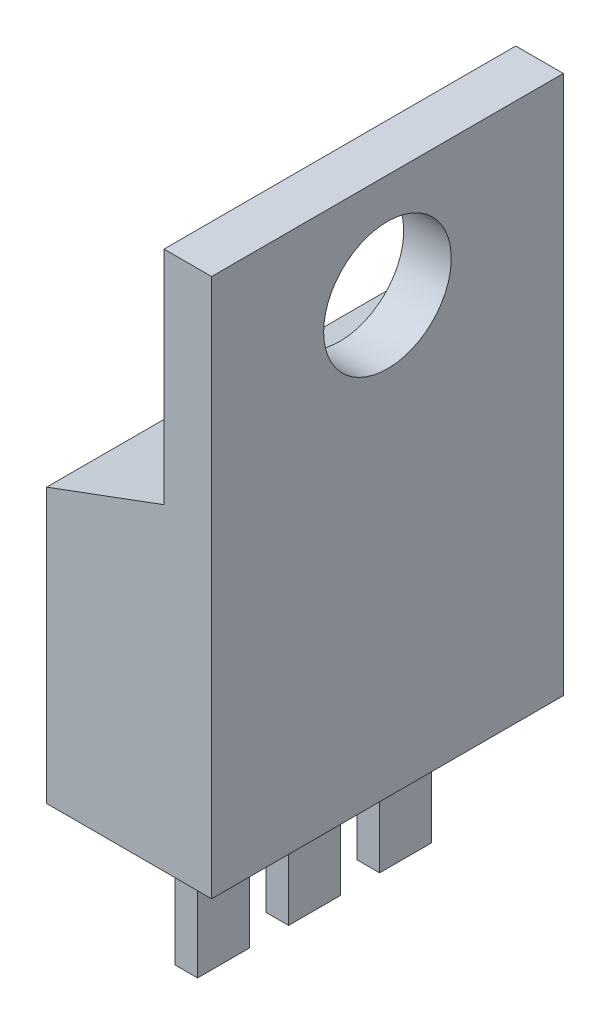
ISO-10303-21;
HEADER;
FILE_DESCRIPTION(('STEP AP214'),'2;1');
FILE_NAME('part.step','',(''),(''),'','','');
FILE_SCHEMA(('AUTOMOTIVE_DESIGN { 1 0 10303 214 1 1 1 1 }'));
ENDSEC;
DATA;
#1=APPLICATION_CONTEXT('core data for automotive mechanical design processes');
#2=APPLICATION_PROTOCOL_DEFINITION('international standard','automotive_design',2000,#1);
#3=PRODUCT_CONTEXT('',#1,'mechanical');
#4=PRODUCT('Part','Part','',(#3));
#5=PRODUCT_RELATED_PRODUCT_CATEGORY('part','',(#4));
#6=PRODUCT_DEFINITION_FORMATION('','',#4);
#7=PRODUCT_DEFINITION_CONTEXT('part definition',#1,'design');
#8=PRODUCT_DEFINITION('design','',#6,#7);
#9=PRODUCT_DEFINITION_SHAPE('','',#8);
#10=(LENGTH_UNIT() NAMED_UNIT(*) SI_UNIT(.MILLI.,.METRE.));
#11=(NAMED_UNIT(*) PLANE_ANGLE_UNIT() SI_UNIT($,.RADIAN.));
#12=(NAMED_UNIT(*) SI_UNIT($,.STERADIAN.) SOLID_ANGLE_UNIT());
#13=UNCERTAINTY_MEASURE_WITH_UNIT(LENGTH_MEASURE(1.E-05),#10,'distance_accuracy_value','');
#14=(GEOMETRIC_REPRESENTATION_CONTEXT(3) GLOBAL_UNCERTAINTY_ASSIGNED_CONTEXT((#13)) GLOBAL_UNIT_ASSIGNED_CONTEXT((#10,
#11,#12)) REPRESENTATION_CONTEXT('',''));
#15=CARTESIAN_POINT('',(0.,0.,0.));
#16=DIRECTION('',(0.,0.,1.));
#17=DIRECTION('',(1.,0.,0.));
#18=AXIS2_PLACEMENT_3D('',#15,#16,#17);
#19=CARTESIAN_POINT('',(-0.74,0.,0.));
#20=DIRECTION('',(1.,0.,0.));
#21=DIRECTION('',(0.,0.,-1.));
#22=AXIS2_PLACEMENT_3D('',#19,#20,#21);
#23=PLANE('',#22);
#24=DIRECTION('',(0.,1.,0.));
#25=VECTOR('',#24,1.);
#26=CARTESIAN_POINT('',(-0.74,-13.21,7.04));
#27=LINE('',#26,#25);
#28=CARTESIAN_POINT('',(-0.74,-9.28,7.04));
#29=VERTEX_POINT('',#28);
#30=CARTESIAN_POINT('',(-0.74,-13.21,7.04));
#31=VERTEX_POINT('',#30);
#32=EDGE_CURVE('E144',#29,#31,#27,.F.);
#33=ORIENTED_EDGE('',*,*,#32,.F.);
#34=DIRECTION('',(0.,0.,-1.));
#35=VECTOR('',#34,1.);
#36=CARTESIAN_POINT('',(-0.74,-9.28,0.));
#37=LINE('',#36,#35);
#38=CARTESIAN_POINT('',(-0.74,-9.28,8.56));
#39=VERTEX_POINT('',#38);
#40=EDGE_CURVE('E141',#29,#39,#37,.F.);
#41=ORIENTED_EDGE('',*,*,#40,.T.);
#42=DIRECTION('',(0.,1.,0.));
#43=VECTOR('',#42,1.);
#44=CARTESIAN_POINT('',(-0.74,-9.28,8.56));
#45=LINE('',#44,#43);
#46=CARTESIAN_POINT('',(-0.74,-13.21,8.56));
#47=VERTEX_POINT('',#46);
#48=EDGE_CURVE('E138',#47,#39,#45,.T.);
#49=ORIENTED_EDGE('',*,*,#48,.F.);
#50=DIRECTION('',(0.,0.,-1.));
#51=VECTOR('',#50,1.);
#52=CARTESIAN_POINT('',(-0.74,-13.21,8.56));
#53=LINE('',#52,#51);
#54=EDGE_CURVE('E157',#31,#47,#53,.F.);
#55=ORIENTED_EDGE('',*,*,#54,.F.);
#56=EDGE_LOOP('',(#33,#41,#49,#55));
#57=FACE_BOUND('',#56,.T.);
#58=ADVANCED_FACE('F17',(#57),#23,.T.);
#59=CARTESIAN_POINT('',(-0.74,0.,0.));
#60=DIRECTION('',(1.,0.,0.));
#61=DIRECTION('',(0.,0.,-1.));
#62=AXIS2_PLACEMENT_3D('',#59,#60,#61);
#63=PLANE('',#62);
#64=DIRECTION('',(0.,1.,0.));
#65=VECTOR('',#64,1.);
#66=CARTESIAN_POINT('',(-0.74,-13.21,4.38));
#67=LINE('',#66,#65);
#68=CARTESIAN_POINT('',(-0.74,-9.28,4.38));
#69=VERTEX_POINT('',#68);
#70=CARTESIAN_POINT('',(-0.74,-13.21,4.38));
#71=VERTEX_POINT('',#70);
#72=EDGE_CURVE('E176',#69,#71,#67,.F.);
#73=ORIENTED_EDGE('',*,*,#72,.F.);
#74=DIRECTION('',(0.,0.,-1.));
#75=VECTOR('',#74,1.);
#76=CARTESIAN_POINT('',(-0.74,-9.28,0.));
#77=LINE('',#76,#75);
#78=CARTESIAN_POINT('',(-0.74,-9.28,5.9));
#79=VERTEX_POINT('',#78);
#80=EDGE_CURVE('E147',#69,#79,#77,.F.);
#81=ORIENTED_EDGE('',*,*,#80,.T.);
#82=DIRECTION('',(0.,1.,0.));
#83=VECTOR('',#82,1.);
#84=CARTESIAN_POINT('',(-0.74,-9.28,5.9));
#85=LINE('',#84,#83);
#86=CARTESIAN_POINT('',(-0.74,-13.21,5.9));
#87=VERTEX_POINT('',#86);
#88=EDGE_CURVE('E173',#87,#79,#85,.T.);
#89=ORIENTED_EDGE('',*,*,#88,.F.);
#90=DIRECTION('',(0.,0.,-1.));
#91=VECTOR('',#90,1.);
#92=CARTESIAN_POINT('',(-0.74,-13.21,5.9));
#93=LINE('',#92,#91);
#94=EDGE_CURVE('E185',#71,#87,#93,.F.);
#95=ORIENTED_EDGE('',*,*,#94,.F.);
#96=EDGE_LOOP('',(#73,#81,#89,#95));
#97=FACE_BOUND('',#96,.T.);
#98=ADVANCED_FACE('F171',(#97),#63,.T.);
#99=CARTESIAN_POINT('',(-0.74,0.,0.));
#100=DIRECTION('',(1.,0.,0.));
#101=DIRECTION('',(0.,0.,-1.));
#102=AXIS2_PLACEMENT_3D('',#99,#100,#101);
#103=PLANE('',#102);
#104=DIRECTION('',(0.,1.,0.));
#105=VECTOR('',#104,1.);
#106=CARTESIAN_POINT('',(-0.74,-13.21,1.72));
#107=LINE('',#106,#105);
#108=CARTESIAN_POINT('',(-0.74,-9.28,1.72));
#109=VERTEX_POINT('',#108);
#110=CARTESIAN_POINT('',(-0.74,-13.21,1.72));
#111=VERTEX_POINT('',#110);
#112=EDGE_CURVE('E250',#109,#111,#107,.F.);
#113=ORIENTED_EDGE('',*,*,#112,.F.);
#114=DIRECTION('',(0.,0.,-1.));
#115=VECTOR('',#114,1.);
#116=CARTESIAN_POINT('',(-0.74,-9.28,0.));
#117=LINE('',#116,#115);
#118=CARTESIAN_POINT('',(-0.74,-9.28,3.24));
#119=VERTEX_POINT('',#118);
#120=EDGE_CURVE('E163',#109,#119,#117,.F.);
#121=ORIENTED_EDGE('',*,*,#120,.T.);
#122=DIRECTION('',(0.,1.,0.));
#123=VECTOR('',#122,1.);
#124=CARTESIAN_POINT('',(-0.74,-9.28,3.24));
#125=LINE('',#124,#123);
#126=CARTESIAN_POINT('',(-0.74,-13.21,3.24));
#127=VERTEX_POINT('',#126);
#128=EDGE_CURVE('E261',#127,#119,#125,.T.);
#129=ORIENTED_EDGE('',*,*,#128,.F.);
#130=DIRECTION('',(0.,0.,-1.));
#131=VECTOR('',#130,1.);
#132=CARTESIAN_POINT('',(-0.74,-13.21,3.24));
#133=LINE('',#132,#131);
#134=EDGE_CURVE('E256',#111,#127,#133,.F.);
#135=ORIENTED_EDGE('',*,*,#134,.F.);
#136=EDGE_LOOP('',(#113,#121,#129,#135));
#137=FACE_BOUND('',#136,.T.);
#138=ADVANCED_FACE('F365',(#137),#103,.T.);
#139=CARTESIAN_POINT('',(-1.4,-9.28,8.56));
#140=DIRECTION('',(0.,0.,1.));
#141=DIRECTION('',(1.,0.,0.));
#142=AXIS2_PLACEMENT_3D('',#139,#140,#141);
#143=PLANE('',#142);
#144=ORIENTED_EDGE('',*,*,#48,.T.);
#145=DIRECTION('',(1.,0.,0.));
#146=VECTOR('',#145,1.);
#147=CARTESIAN_POINT('',(-1.4,-9.28,8.56));
#148=LINE('',#147,#146);
#149=CARTESIAN_POINT('',(-1.4,-9.28,8.56));
#150=VERTEX_POINT('',#149);
#151=EDGE_CURVE('E150',#39,#150,#148,.F.);
#152=ORIENTED_EDGE('',*,*,#151,.T.);
#153=DIRECTION('',(0.,1.,0.));
#154=VECTOR('',#153,1.);
#155=CARTESIAN_POINT('',(-1.4,0.,8.56));
#156=LINE('',#155,#154);
#157=CARTESIAN_POINT('',(-1.4,-13.21,8.56));
#158=VERTEX_POINT('',#157);
#159=EDGE_CURVE('E214',#150,#158,#156,.F.);
#160=ORIENTED_EDGE('',*,*,#159,.T.);
#161=DIRECTION('',(1.,0.,0.));
#162=VECTOR('',#161,1.);
#163=CARTESIAN_POINT('',(-1.4,-13.21,8.56));
#164=LINE('',#163,#162);
#165=EDGE_CURVE('E161',#47,#158,#164,.F.);
#166=ORIENTED_EDGE('',*,*,#165,.F.);
#167=EDGE_LOOP('',(#144,#152,#160,#166));
#168=FACE_BOUND('',#167,.T.);
#169=ADVANCED_FACE('F159',(#168),#143,.T.);
#170=CARTESIAN_POINT('',(-1.4,-13.21,8.56));
#171=DIRECTION('',(0.,-1.,0.));
#172=DIRECTION('',(0.,0.,-1.));
#173=AXIS2_PLACEMENT_3D('',#170,#171,#172);
#174=PLANE('',#173);
#175=ORIENTED_EDGE('',*,*,#165,.T.);
#176=DIRECTION('',(0.,0.,-1.));
#177=VECTOR('',#176,1.);
#178=CARTESIAN_POINT('',(-1.4,-13.21,0.));
#179=LINE('',#178,#177);
#180=CARTESIAN_POINT('',(-1.4,-13.21,7.04));
#181=VERTEX_POINT('',#180);
#182=EDGE_CURVE('E204',#158,#181,#179,.T.);
#183=ORIENTED_EDGE('',*,*,#182,.T.);
#184=DIRECTION('',(-1.,0.,0.));
#185=VECTOR('',#184,1.);
#186=CARTESIAN_POINT('',(-1.4,-13.21,7.04));
#187=LINE('',#186,#185);
#188=EDGE_CURVE('E193',#31,#181,#187,.T.);
#189=ORIENTED_EDGE('',*,*,#188,.F.);
#190=ORIENTED_EDGE('',*,*,#54,.T.);
#191=EDGE_LOOP('',(#175,#183,#189,#190));
#192=FACE_BOUND('',#191,.T.);
#193=ADVANCED_FACE('F202',(#192),#174,.T.);
#194=CARTESIAN_POINT('',(-1.4,-13.21,7.04));
#195=DIRECTION('',(0.,0.,-1.));
#196=DIRECTION('',(-1.,0.,0.));
#197=AXIS2_PLACEMENT_3D('',#194,#195,#196);
#198=PLANE('',#197);
#199=DIRECTION('',(0.,1.,0.));
#200=VECTOR('',#199,1.);
#201=CARTESIAN_POINT('',(-1.4,0.,7.04));
#202=LINE('',#201,#200);
#203=CARTESIAN_POINT('',(-1.4,-9.28,7.04));
#204=VERTEX_POINT('',#203);
#205=EDGE_CURVE('E209',#181,#204,#202,.T.);
#206=ORIENTED_EDGE('',*,*,#205,.T.);
#207=DIRECTION('',(-1.,0.,0.));
#208=VECTOR('',#207,1.);
#209=CARTESIAN_POINT('',(-1.4,-9.28,7.04));
#210=LINE('',#209,#208);
#211=EDGE_CURVE('E191',#204,#29,#210,.F.);
#212=ORIENTED_EDGE('',*,*,#211,.T.);
#213=ORIENTED_EDGE('',*,*,#32,.T.);
#214=ORIENTED_EDGE('',*,*,#188,.T.);
#215=EDGE_LOOP('',(#206,#212,#213,#214));
#216=FACE_BOUND('',#215,.T.);
#217=ADVANCED_FACE('F208',(#216),#198,.T.);
#218=CARTESIAN_POINT('',(-1.4,-9.28,5.9));
#219=DIRECTION('',(0.,0.,1.));
#220=DIRECTION('',(1.,0.,0.));
#221=AXIS2_PLACEMENT_3D('',#218,#219,#220);
#222=PLANE('',#221);
#223=ORIENTED_EDGE('',*,*,#88,.T.);
#224=DIRECTION('',(1.,0.,0.));
#225=VECTOR('',#224,1.);
#226=CARTESIAN_POINT('',(-1.4,-9.28,5.9));
#227=LINE('',#226,#225);
#228=CARTESIAN_POINT('',(-1.4,-9.28,5.9));
#229=VERTEX_POINT('',#228);
#230=EDGE_CURVE('E180',#79,#229,#227,.F.);
#231=ORIENTED_EDGE('',*,*,#230,.T.);
#232=DIRECTION('',(0.,1.,0.));
#233=VECTOR('',#232,1.);
#234=CARTESIAN_POINT('',(-1.4,0.,5.9));
#235=LINE('',#234,#233);
#236=CARTESIAN_POINT('',(-1.4,-13.21,5.9));
#237=VERTEX_POINT('',#236);
#238=EDGE_CURVE('E211',#229,#237,#235,.F.);
#239=ORIENTED_EDGE('',*,*,#238,.T.);
#240=DIRECTION('',(1.,0.,0.));
#241=VECTOR('',#240,1.);
#242=CARTESIAN_POINT('',(-1.4,-13.21,5.9));
#243=LINE('',#242,#241);
#244=EDGE_CURVE('E189',#87,#237,#243,.F.);
#245=ORIENTED_EDGE('',*,*,#244,.F.);
#246=EDGE_LOOP('',(#223,#231,#239,#245));
#247=FACE_BOUND('',#246,.T.);
#248=ADVANCED_FACE('F187',(#247),#222,.T.);
#249=CARTESIAN_POINT('',(-1.4,-13.21,5.9));
#250=DIRECTION('',(0.,-1.,0.));
#251=DIRECTION('',(0.,0.,-1.));
#252=AXIS2_PLACEMENT_3D('',#249,#250,#251);
#253=PLANE('',#252);
#254=ORIENTED_EDGE('',*,*,#244,.T.);
#255=DIRECTION('',(0.,0.,-1.));
#256=VECTOR('',#255,1.);
#257=CARTESIAN_POINT('',(-1.4,-13.21,0.));
#258=LINE('',#257,#256);
#259=CARTESIAN_POINT('',(-1.4,-13.21,4.38));
#260=VERTEX_POINT('',#259);
#261=EDGE_CURVE('E239',#237,#260,#258,.T.);
#262=ORIENTED_EDGE('',*,*,#261,.T.);
#263=DIRECTION('',(-1.,0.,0.));
#264=VECTOR('',#263,1.);
#265=CARTESIAN_POINT('',(-1.4,-13.21,4.38));
#266=LINE('',#265,#264);
#267=EDGE_CURVE('E266',#71,#260,#266,.T.);
#268=ORIENTED_EDGE('',*,*,#267,.F.);
#269=ORIENTED_EDGE('',*,*,#94,.T.);
#270=EDGE_LOOP('',(#254,#262,#268,#269));
#271=FACE_BOUND('',#270,.T.);
#272=ADVANCED_FACE('F272',(#271),#253,.T.);
#273=CARTESIAN_POINT('',(-1.4,-13.21,4.38));
#274=DIRECTION('',(0.,0.,-1.));
#275=DIRECTION('',(-1.,0.,0.));
#276=AXIS2_PLACEMENT_3D('',#273,#274,#275);
#277=PLANE('',#276);
#278=DIRECTION('',(0.,1.,0.));
#279=VECTOR('',#278,1.);
#280=CARTESIAN_POINT('',(-1.4,0.,4.38));
#281=LINE('',#280,#279);
#282=CARTESIAN_POINT('',(-1.4,-9.28,4.38));
#283=VERTEX_POINT('',#282);
#284=EDGE_CURVE('E236',#260,#283,#281,.T.);
#285=ORIENTED_EDGE('',*,*,#284,.T.);
#286=DIRECTION('',(-1.,0.,0.));
#287=VECTOR('',#286,1.);
#288=CARTESIAN_POINT('',(-1.4,-9.28,4.38));
#289=LINE('',#288,#287);
#290=EDGE_CURVE('E264',#283,#69,#289,.F.);
#291=ORIENTED_EDGE('',*,*,#290,.T.);
#292=ORIENTED_EDGE('',*,*,#72,.T.);
#293=ORIENTED_EDGE('',*,*,#267,.T.);
#294=EDGE_LOOP('',(#285,#291,#292,#293));
#295=FACE_BOUND('',#294,.T.);
#296=ADVANCED_FACE('F276',(#295),#277,.T.);
#297=CARTESIAN_POINT('',(-1.4,-9.28,3.24));
#298=DIRECTION('',(0.,0.,1.));
#299=DIRECTION('',(1.,0.,0.));
#300=AXIS2_PLACEMENT_3D('',#297,#298,#299);
#301=PLANE('',#300);
#302=ORIENTED_EDGE('',*,*,#128,.T.);
#303=DIRECTION('',(1.,0.,0.));
#304=VECTOR('',#303,1.);
#305=CARTESIAN_POINT('',(-1.4,-9.28,3.24));
#306=LINE('',#305,#304);
#307=CARTESIAN_POINT('',(-1.4,-9.28,3.24));
#308=VERTEX_POINT('',#307);
#309=EDGE_CURVE('E259',#119,#308,#306,.F.);
#310=ORIENTED_EDGE('',*,*,#309,.T.);
#311=DIRECTION('',(0.,1.,0.));
#312=VECTOR('',#311,1.);
#313=CARTESIAN_POINT('',(-1.4,0.,3.24));
#314=LINE('',#313,#312);
#315=CARTESIAN_POINT('',(-1.4,-13.21,3.24));
#316=VERTEX_POINT('',#315);
#317=EDGE_CURVE('E234',#308,#316,#314,.F.);
#318=ORIENTED_EDGE('',*,*,#317,.T.);
#319=DIRECTION('',(1.,0.,0.));
#320=VECTOR('',#319,1.);
#321=CARTESIAN_POINT('',(-1.4,-13.21,3.24));
#322=LINE('',#321,#320);
#323=EDGE_CURVE('E253',#127,#316,#322,.F.);
#324=ORIENTED_EDGE('',*,*,#323,.F.);
#325=EDGE_LOOP('',(#302,#310,#318,#324));
#326=FACE_BOUND('',#325,.T.);
#327=ADVANCED_FACE('F359',(#326),#301,.T.);
#328=CARTESIAN_POINT('',(-1.4,-13.21,3.24));
#329=DIRECTION('',(0.,-1.,0.));
#330=DIRECTION('',(0.,0.,-1.));
#331=AXIS2_PLACEMENT_3D('',#328,#329,#330);
#332=PLANE('',#331);
#333=ORIENTED_EDGE('',*,*,#323,.T.);
#334=DIRECTION('',(0.,0.,-1.));
#335=VECTOR('',#334,1.);
#336=CARTESIAN_POINT('',(-1.4,-13.21,0.));
#337=LINE('',#336,#335);
#338=CARTESIAN_POINT('',(-1.4,-13.21,1.72));
#339=VERTEX_POINT('',#338);
#340=EDGE_CURVE('E232',#316,#339,#337,.T.);
#341=ORIENTED_EDGE('',*,*,#340,.T.);
#342=DIRECTION('',(-1.,0.,0.));
#343=VECTOR('',#342,1.);
#344=CARTESIAN_POINT('',(-1.4,-13.21,1.72));
#345=LINE('',#344,#343);
#346=EDGE_CURVE('E247',#111,#339,#345,.T.);
#347=ORIENTED_EDGE('',*,*,#346,.F.);
#348=ORIENTED_EDGE('',*,*,#134,.T.);
#349=EDGE_LOOP('',(#333,#341,#347,#348));
#350=FACE_BOUND('',#349,.T.);
#351=ADVANCED_FACE('F361',(#350),#332,.T.);
#352=CARTESIAN_POINT('',(-1.4,-13.21,1.72));
#353=DIRECTION('',(0.,0.,-1.));
#354=DIRECTION('',(-1.,0.,0.));
#355=AXIS2_PLACEMENT_3D('',#352,#353,#354);
#356=PLANE('',#355);
#357=DIRECTION('',(0.,1.,0.));
#358=VECTOR('',#357,1.);
#359=CARTESIAN_POINT('',(-1.4,0.,1.72));
#360=LINE('',#359,#358);
#361=CARTESIAN_POINT('',(-1.4,-9.28,1.72));
#362=VERTEX_POINT('',#361);
#363=EDGE_CURVE('E229',#339,#362,#360,.T.);
#364=ORIENTED_EDGE('',*,*,#363,.T.);
#365=DIRECTION('',(-1.,0.,0.));
#366=VECTOR('',#365,1.);
#367=CARTESIAN_POINT('',(-1.4,-9.28,1.72));
#368=LINE('',#367,#366);
#369=EDGE_CURVE('E244',#362,#109,#368,.F.);
#370=ORIENTED_EDGE('',*,*,#369,.T.);
#371=ORIENTED_EDGE('',*,*,#112,.T.);
#372=ORIENTED_EDGE('',*,*,#346,.T.);
#373=EDGE_LOOP('',(#364,#370,#371,#372));
#374=FACE_BOUND('',#373,.T.);
#375=ADVANCED_FACE('F290',(#374),#356,.T.);
#376=CARTESIAN_POINT('',(-1.4,0.,0.));
#377=DIRECTION('',(1.,0.,0.));
#378=DIRECTION('',(0.,0.,-1.));
#379=AXIS2_PLACEMENT_3D('',#376,#377,#378);
#380=PLANE('',#379);
#381=ORIENTED_EDGE('',*,*,#182,.F.);
#382=ORIENTED_EDGE('',*,*,#159,.F.);
#383=DIRECTION('',(0.,0.,-1.));
#384=VECTOR('',#383,1.);
#385=CARTESIAN_POINT('',(-1.4,-9.28,0.));
#386=LINE('',#385,#384);
#387=EDGE_CURVE('E154',#204,#150,#386,.F.);
#388=ORIENTED_EDGE('',*,*,#387,.F.);
#389=ORIENTED_EDGE('',*,*,#205,.F.);
#390=EDGE_LOOP('',(#381,#382,#388,#389));
#391=FACE_BOUND('',#390,.T.);
#392=ADVANCED_FACE('F213',(#391),#380,.F.);
#393=CARTESIAN_POINT('',(-1.4,0.,0.));
#394=DIRECTION('',(1.,0.,0.));
#395=DIRECTION('',(0.,0.,-1.));
#396=AXIS2_PLACEMENT_3D('',#393,#394,#395);
#397=PLANE('',#396);
#398=ORIENTED_EDGE('',*,*,#261,.F.);
#399=ORIENTED_EDGE('',*,*,#238,.F.);
#400=DIRECTION('',(0.,0.,-1.));
#401=VECTOR('',#400,1.);
#402=CARTESIAN_POINT('',(-1.4,-9.28,0.));
#403=LINE('',#402,#401);
#404=EDGE_CURVE('E182',#283,#229,#403,.F.);
#405=ORIENTED_EDGE('',*,*,#404,.F.);
#406=ORIENTED_EDGE('',*,*,#284,.F.);
#407=EDGE_LOOP('',(#398,#399,#405,#406));
#408=FACE_BOUND('',#407,.T.);
#409=ADVANCED_FACE('F278',(#408),#397,.F.);
#410=CARTESIAN_POINT('',(-1.4,0.,0.));
#411=DIRECTION('',(1.,0.,0.));
#412=DIRECTION('',(0.,0.,-1.));
#413=AXIS2_PLACEMENT_3D('',#410,#411,#412);
#414=PLANE('',#413);
#415=ORIENTED_EDGE('',*,*,#340,.F.);
#416=ORIENTED_EDGE('',*,*,#317,.F.);
#417=DIRECTION('',(0.,0.,-1.));
#418=VECTOR('',#417,1.);
#419=CARTESIAN_POINT('',(-1.4,-9.28,0.));
#420=LINE('',#419,#418);
#421=EDGE_CURVE('E217',#362,#308,#420,.F.);
#422=ORIENTED_EDGE('',*,*,#421,.F.);
#423=ORIENTED_EDGE('',*,*,#363,.F.);
#424=EDGE_LOOP('',(#415,#416,#422,#423));
#425=FACE_BOUND('',#424,.T.);
#426=ADVANCED_FACE('F280',(#425),#414,.F.);
#427=CARTESIAN_POINT('',(0.,0.,0.));
#428=DIRECTION('',(-0.347225307751611,0.937781736683328,0.));
#429=DIRECTION('',(-0.937781736683328,-0.347225307751611,0.));
#430=AXIS2_PLACEMENT_3D('',#427,#428,#429);
#431=PLANE('',#430);
#432=DIRECTION('',(0.,0.,1.));
#433=VECTOR('',#432,1.);
#434=CARTESIAN_POINT('',(0.,0.,0.));
#435=LINE('',#434,#433);
#436=CARTESIAN_POINT('',(0.,0.,0.));
#437=VERTEX_POINT('',#436);
#438=CARTESIAN_POINT('',(0.,0.,10.28));
#439=VERTEX_POINT('',#438);
#440=EDGE_CURVE('E220',#437,#439,#435,.T.);
#441=ORIENTED_EDGE('',*,*,#440,.F.);
#442=DIRECTION('',(-0.937781736683347,-0.34722530775156,0.));
#443=VECTOR('',#442,1.);
#444=CARTESIAN_POINT('',(0.,0.,0.));
#445=LINE('',#444,#443);
#446=CARTESIAN_POINT('',(-3.42999999999997,-1.27000000000009,0.));
#447=VERTEX_POINT('',#446);
#448=EDGE_CURVE('E332',#437,#447,#445,.T.);
#449=ORIENTED_EDGE('',*,*,#448,.T.);
#450=DIRECTION('',(0.,0.,1.));
#451=VECTOR('',#450,1.);
#452=CARTESIAN_POINT('',(-3.43,-1.27,0.));
#453=LINE('',#452,#451);
#454=CARTESIAN_POINT('',(-3.42999999999997,-1.27000000000009,10.28));
#455=VERTEX_POINT('',#454);
#456=EDGE_CURVE('E226',#455,#447,#453,.F.);
#457=ORIENTED_EDGE('',*,*,#456,.F.);
#458=DIRECTION('',(-0.937781736683347,-0.34722530775156,0.));
#459=VECTOR('',#458,1.);
#460=CARTESIAN_POINT('',(0.,0.,10.28));
#461=LINE('',#460,#459);
#462=EDGE_CURVE('E334',#439,#455,#461,.T.);
#463=ORIENTED_EDGE('',*,*,#462,.F.);
#464=EDGE_LOOP('',(#441,#449,#457,#463));
#465=FACE_BOUND('',#464,.T.);
#466=ADVANCED_FACE('F287',(#465),#431,.T.);
#467=CARTESIAN_POINT('',(-3.43,-1.27,0.));
#468=DIRECTION('',(-1.,0.,0.));
#469=DIRECTION('',(0.,0.,1.));
#470=AXIS2_PLACEMENT_3D('',#467,#468,#469);
#471=PLANE('',#470);
#472=ORIENTED_EDGE('',*,*,#456,.T.);
#473=DIRECTION('',(0.,1.,0.));
#474=VECTOR('',#473,1.);
#475=CARTESIAN_POINT('',(-3.43,0.,0.));
#476=LINE('',#475,#474);
#477=CARTESIAN_POINT('',(-3.43,-9.28,0.));
#478=VERTEX_POINT('',#477);
#479=EDGE_CURVE('E346',#447,#478,#476,.F.);
#480=ORIENTED_EDGE('',*,*,#479,.T.);
#481=DIRECTION('',(0.,0.,-1.));
#482=VECTOR('',#481,1.);
#483=CARTESIAN_POINT('',(-3.43,-9.28,0.));
#484=LINE('',#483,#482);
#485=CARTESIAN_POINT('',(-3.43,-9.28,10.28));
#486=VERTEX_POINT('',#485);
#487=EDGE_CURVE('E215',#486,#478,#484,.T.);
#488=ORIENTED_EDGE('',*,*,#487,.F.);
#489=DIRECTION('',(0.,1.,0.));
#490=VECTOR('',#489,1.);
#491=CARTESIAN_POINT('',(-3.43,0.,10.28));
#492=LINE('',#491,#490);
#493=EDGE_CURVE('E539',#455,#486,#492,.F.);
#494=ORIENTED_EDGE('',*,*,#493,.F.);
#495=EDGE_LOOP('',(#472,#480,#488,#494));
#496=FACE_BOUND('',#495,.T.);
#497=ADVANCED_FACE('F321',(#496),#471,.T.);
#498=CARTESIAN_POINT('',(0.,6.47,0.));
#499=DIRECTION('',(-1.,0.,0.));
#500=DIRECTION('',(0.,0.,1.));
#501=AXIS2_PLACEMENT_3D('',#498,#499,#500);
#502=PLANE('',#501);
#503=CARTESIAN_POINT('',(0.,3.43,5.14));
#504=DIRECTION('',(-1.,0.,0.));
#505=DIRECTION('',(0.,0.,1.));
#506=AXIS2_PLACEMENT_3D('',#503,#504,#505);
#507=CIRCLE('',#506,1.865);
#508=CARTESIAN_POINT('',(0.,3.43,7.005));
#509=VERTEX_POINT('',#508);
#510=EDGE_CURVE('E20',#509,#509,#507,.F.);
#511=ORIENTED_EDGE('',*,*,#510,.T.);
#512=EDGE_LOOP('',(#511));
#513=FACE_BOUND('',#512,.T.);
#514=DIRECTION('',(0.,0.,1.));
#515=VECTOR('',#514,1.);
#516=CARTESIAN_POINT('',(0.,6.47,0.));
#517=LINE('',#516,#515);
#518=CARTESIAN_POINT('',(0.,6.47,0.));
#519=VERTEX_POINT('',#518);
#520=CARTESIAN_POINT('',(0.,6.47,10.28));
#521=VERTEX_POINT('',#520);
#522=EDGE_CURVE('E340',#519,#521,#517,.T.);
#523=ORIENTED_EDGE('',*,*,#522,.F.);
#524=DIRECTION('',(0.,1.,0.));
#525=VECTOR('',#524,1.);
#526=CARTESIAN_POINT('',(0.,0.,0.));
#527=LINE('',#526,#525);
#528=EDGE_CURVE('E339',#519,#437,#527,.F.);
#529=ORIENTED_EDGE('',*,*,#528,.T.);
#530=ORIENTED_EDGE('',*,*,#440,.T.);
#531=DIRECTION('',(0.,1.,0.));
#532=VECTOR('',#531,1.);
#533=CARTESIAN_POINT('',(0.,0.,10.28));
#534=LINE('',#533,#532);
#535=EDGE_CURVE('E546',#521,#439,#534,.F.);
#536=ORIENTED_EDGE('',*,*,#535,.F.);
#537=EDGE_LOOP('',(#523,#529,#530,#536));
#538=FACE_BOUND('',#537,.T.);
#539=ADVANCED_FACE('F317',(#513,#538),#502,.T.);
#540=CARTESIAN_POINT('',(-3.43,-9.28,0.));
#541=DIRECTION('',(0.,-1.,0.));
#542=DIRECTION('',(0.,0.,-1.));
#543=AXIS2_PLACEMENT_3D('',#540,#541,#542);
#544=PLANE('',#543);
#545=ORIENTED_EDGE('',*,*,#369,.F.);
#546=ORIENTED_EDGE('',*,*,#421,.T.);
#547=ORIENTED_EDGE('',*,*,#309,.F.);
#548=ORIENTED_EDGE('',*,*,#120,.F.);
#549=EDGE_LOOP('',(#545,#546,#547,#548));
#550=FACE_BOUND('',#549,.T.);
#551=ORIENTED_EDGE('',*,*,#290,.F.);
#552=ORIENTED_EDGE('',*,*,#404,.T.);
#553=ORIENTED_EDGE('',*,*,#230,.F.);
#554=ORIENTED_EDGE('',*,*,#80,.F.);
#555=EDGE_LOOP('',(#551,#552,#553,#554));
#556=FACE_BOUND('',#555,.T.);
#557=ORIENTED_EDGE('',*,*,#211,.F.);
#558=ORIENTED_EDGE('',*,*,#387,.T.);
#559=ORIENTED_EDGE('',*,*,#151,.F.);
#560=ORIENTED_EDGE('',*,*,#40,.F.);
#561=EDGE_LOOP('',(#557,#558,#559,#560));
#562=FACE_BOUND('',#561,.T.);
#563=ORIENTED_EDGE('',*,*,#487,.T.);
#564=DIRECTION('',(1.,0.,0.));
#565=VECTOR('',#564,1.);
#566=CARTESIAN_POINT('',(0.,-9.28,0.));
#567=LINE('',#566,#565);
#568=CARTESIAN_POINT('',(1.39,-9.28,0.));
#569=VERTEX_POINT('',#568);
#570=EDGE_CURVE('E348',#478,#569,#567,.T.);
#571=ORIENTED_EDGE('',*,*,#570,.T.);
#572=DIRECTION('',(0.,0.,-1.));
#573=VECTOR('',#572,1.);
#574=CARTESIAN_POINT('',(1.39,-9.28,0.));
#575=LINE('',#574,#573);
#576=CARTESIAN_POINT('',(1.39,-9.28,10.28));
#577=VERTEX_POINT('',#576);
#578=EDGE_CURVE('E548',#577,#569,#575,.T.);
#579=ORIENTED_EDGE('',*,*,#578,.F.);
#580=DIRECTION('',(1.,0.,0.));
#581=VECTOR('',#580,1.);
#582=CARTESIAN_POINT('',(0.,-9.28,10.28));
#583=LINE('',#582,#581);
#584=EDGE_CURVE('E542',#486,#577,#583,.T.);
#585=ORIENTED_EDGE('',*,*,#584,.F.);
#586=EDGE_LOOP('',(#563,#571,#579,#585));
#587=FACE_BOUND('',#586,.T.);
#588=ADVANCED_FACE('F151',(#550,#556,#562,#587),#544,.T.);
#589=CARTESIAN_POINT('',(0.,0.,0.));
#590=DIRECTION('',(0.,0.,1.));
#591=DIRECTION('',(1.,0.,0.));
#592=AXIS2_PLACEMENT_3D('',#589,#590,#591);
#593=PLANE('',#592);
#594=DIRECTION('',(0.,1.,0.));
#595=VECTOR('',#594,1.);
#596=CARTESIAN_POINT('',(1.39,-9.28,0.));
#597=LINE('',#596,#595);
#598=CARTESIAN_POINT('',(1.39,6.47,0.));
#599=VERTEX_POINT('',#598);
#600=EDGE_CURVE('E551',#569,#599,#597,.T.);
#601=ORIENTED_EDGE('',*,*,#600,.F.);
#602=ORIENTED_EDGE('',*,*,#570,.F.);
#603=ORIENTED_EDGE('',*,*,#479,.F.);
#604=ORIENTED_EDGE('',*,*,#448,.F.);
#605=ORIENTED_EDGE('',*,*,#528,.F.);
#606=DIRECTION('',(1.,0.,0.));
#607=VECTOR('',#606,1.);
#608=CARTESIAN_POINT('',(1.39,6.47,0.));
#609=LINE('',#608,#607);
#610=EDGE_CURVE('E536',#599,#519,#609,.F.);
#611=ORIENTED_EDGE('',*,*,#610,.F.);
#612=EDGE_LOOP('',(#601,#602,#603,#604,#605,#611));
#613=FACE_BOUND('',#612,.T.);
#614=ADVANCED_FACE('F311',(#613),#593,.F.);
#615=CARTESIAN_POINT('',(1.39,6.47,0.));
#616=DIRECTION('',(0.,1.,0.));
#617=DIRECTION('',(0.,0.,1.));
#618=AXIS2_PLACEMENT_3D('',#615,#616,#617);
#619=PLANE('',#618);
#620=DIRECTION('',(0.,0.,-1.));
#621=VECTOR('',#620,1.);
#622=CARTESIAN_POINT('',(1.39,6.47,0.));
#623=LINE('',#622,#621);
#624=CARTESIAN_POINT('',(1.39,6.47,10.28));
#625=VERTEX_POINT('',#624);
#626=EDGE_CURVE('E554',#599,#625,#623,.F.);
#627=ORIENTED_EDGE('',*,*,#626,.F.);
#628=ORIENTED_EDGE('',*,*,#610,.T.);
#629=ORIENTED_EDGE('',*,*,#522,.T.);
#630=DIRECTION('',(1.,0.,0.));
#631=VECTOR('',#630,1.);
#632=CARTESIAN_POINT('',(0.,6.47,10.28));
#633=LINE('',#632,#631);
#634=EDGE_CURVE('E34',#625,#521,#633,.F.);
#635=ORIENTED_EDGE('',*,*,#634,.F.);
#636=EDGE_LOOP('',(#627,#628,#629,#635));
#637=FACE_BOUND('',#636,.T.);
#638=ADVANCED_FACE('F307',(#637),#619,.T.);
#639=CARTESIAN_POINT('',(0.,0.,10.28));
#640=DIRECTION('',(0.,0.,1.));
#641=DIRECTION('',(1.,0.,0.));
#642=AXIS2_PLACEMENT_3D('',#639,#640,#641);
#643=PLANE('',#642);
#644=ORIENTED_EDGE('',*,*,#634,.T.);
#645=ORIENTED_EDGE('',*,*,#535,.T.);
#646=ORIENTED_EDGE('',*,*,#462,.T.);
#647=ORIENTED_EDGE('',*,*,#493,.T.);
#648=ORIENTED_EDGE('',*,*,#584,.T.);
#649=DIRECTION('',(0.,1.,0.));
#650=VECTOR('',#649,1.);
#651=CARTESIAN_POINT('',(1.39,-9.28,10.28));
#652=LINE('',#651,#650);
#653=EDGE_CURVE('E26',#625,#577,#652,.F.);
#654=ORIENTED_EDGE('',*,*,#653,.F.);
#655=EDGE_LOOP('',(#644,#645,#646,#647,#648,#654));
#656=FACE_BOUND('',#655,.T.);
#657=ADVANCED_FACE('F300',(#656),#643,.T.);
#658=CARTESIAN_POINT('',(0.,3.43,5.14));
#659=DIRECTION('',(-1.,0.,0.));
#660=DIRECTION('',(0.,0.,1.));
#661=AXIS2_PLACEMENT_3D('',#658,#659,#660);
#662=CYLINDRICAL_SURFACE('',#661,1.865);
#663=CARTESIAN_POINT('',(1.39,3.43,5.14));
#664=DIRECTION('',(-1.,0.,0.));
#665=DIRECTION('',(0.,0.,1.));
#666=AXIS2_PLACEMENT_3D('',#663,#664,#665);
#667=CIRCLE('',#666,1.865);
#668=CARTESIAN_POINT('',(1.39,3.43,7.005));
#669=VERTEX_POINT('',#668);
#670=EDGE_CURVE('E11',#669,#669,#667,.T.);
#671=ORIENTED_EDGE('',*,*,#670,.F.);
#672=EDGE_LOOP('',(#671));
#673=FACE_BOUND('',#672,.T.);
#674=ORIENTED_EDGE('',*,*,#510,.F.);
#675=EDGE_LOOP('',(#674));
#676=FACE_BOUND('',#675,.T.);
#677=ADVANCED_FACE('F294',(#673,#676),#662,.F.);
#678=CARTESIAN_POINT('',(1.39,-9.28,0.));
#679=DIRECTION('',(1.,0.,0.));
#680=DIRECTION('',(0.,0.,-1.));
#681=AXIS2_PLACEMENT_3D('',#678,#679,#680);
#682=PLANE('',#681);
#683=ORIENTED_EDGE('',*,*,#670,.T.);
#684=EDGE_LOOP('',(#683));
#685=FACE_BOUND('',#684,.T.);
#686=ORIENTED_EDGE('',*,*,#626,.T.);
#687=ORIENTED_EDGE('',*,*,#653,.T.);
#688=ORIENTED_EDGE('',*,*,#578,.T.);
#689=ORIENTED_EDGE('',*,*,#600,.T.);
#690=EDGE_LOOP('',(#686,#687,#688,#689));
#691=FACE_BOUND('',#690,.T.);
#692=ADVANCED_FACE('F292',(#685,#691),#682,.T.);
#693=CLOSED_SHELL('',(#58,#98,#138,#169,#193,#217,#248,#272,#296,#327,#351,#375,#392,#409,#426,
#466,#497,#539,#588,#614,#638,#657,#677,#692));
#694=MANIFOLD_SOLID_BREP('B1',#693);
#695=ADVANCED_BREP_SHAPE_REPRESENTATION('',(#18,#694),#14);
#696=SHAPE_DEFINITION_REPRESENTATION(#9,#695);
ENDSEC;
END-ISO-10303-21;
